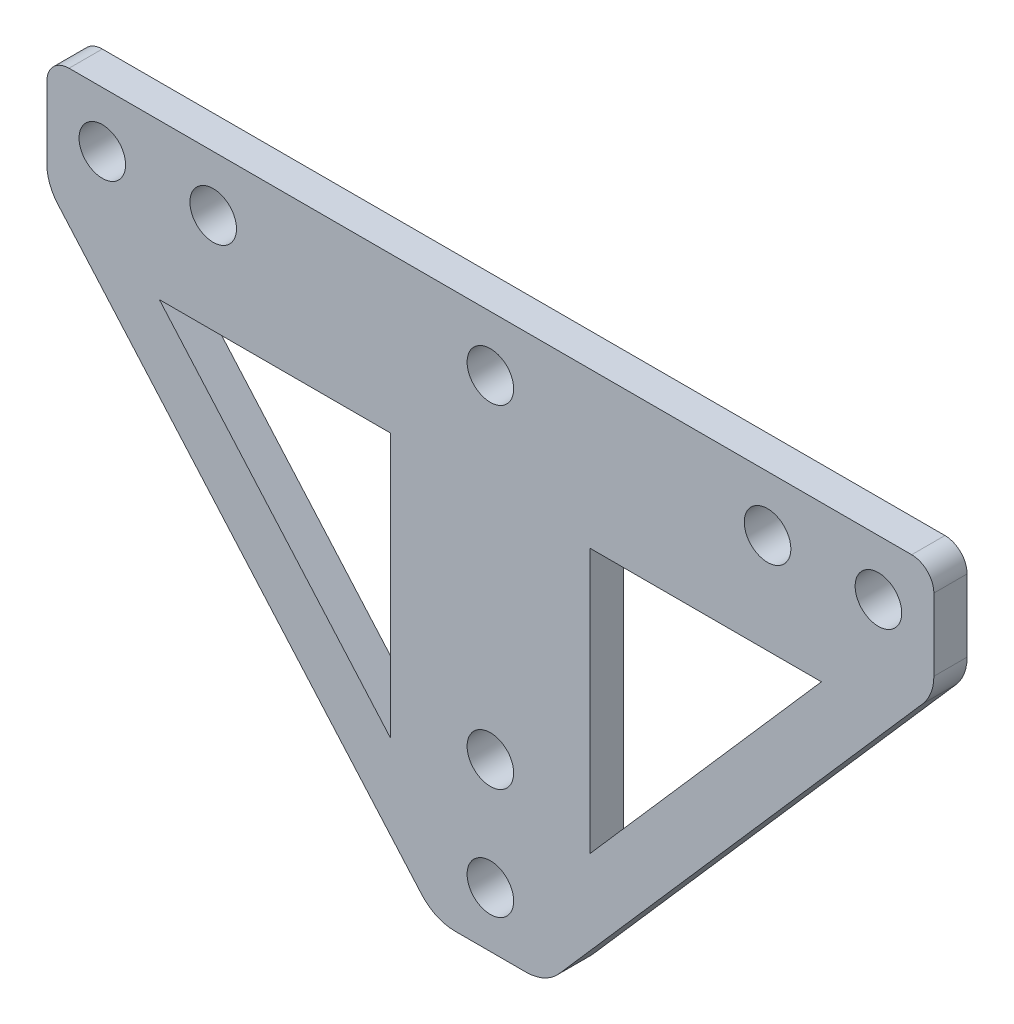
ISO-10303-21;
HEADER;
FILE_DESCRIPTION(('STEP AP214'),'2;1');
FILE_NAME('part.step','',(''),(''),'','','');
FILE_SCHEMA(('AUTOMOTIVE_DESIGN { 1 0 10303 214 1 1 1 1 }'));
ENDSEC;
DATA;
#1=APPLICATION_CONTEXT('core data for automotive mechanical design processes');
#2=APPLICATION_PROTOCOL_DEFINITION('international standard','automotive_design',2000,#1);
#3=PRODUCT_CONTEXT('',#1,'mechanical');
#4=PRODUCT('Part','Part','',(#3));
#5=PRODUCT_RELATED_PRODUCT_CATEGORY('part','',(#4));
#6=PRODUCT_DEFINITION_FORMATION('','',#4);
#7=PRODUCT_DEFINITION_CONTEXT('part definition',#1,'design');
#8=PRODUCT_DEFINITION('design','',#6,#7);
#9=PRODUCT_DEFINITION_SHAPE('','',#8);
#10=(LENGTH_UNIT() NAMED_UNIT(*) SI_UNIT(.MILLI.,.METRE.));
#11=(NAMED_UNIT(*) PLANE_ANGLE_UNIT() SI_UNIT($,.RADIAN.));
#12=(NAMED_UNIT(*) SI_UNIT($,.STERADIAN.) SOLID_ANGLE_UNIT());
#13=UNCERTAINTY_MEASURE_WITH_UNIT(LENGTH_MEASURE(1.E-05),#10,'distance_accuracy_value','');
#14=(GEOMETRIC_REPRESENTATION_CONTEXT(3) GLOBAL_UNCERTAINTY_ASSIGNED_CONTEXT((#13)) GLOBAL_UNIT_ASSIGNED_CONTEXT((#10,
#11,#12)) REPRESENTATION_CONTEXT('',''));
#15=CARTESIAN_POINT('',(0.,0.,0.));
#16=DIRECTION('',(0.,0.,1.));
#17=DIRECTION('',(1.,0.,0.));
#18=AXIS2_PLACEMENT_3D('',#15,#16,#17);
#19=CARTESIAN_POINT('',(0.,-10.,3.));
#20=DIRECTION('',(1.,0.,0.));
#21=DIRECTION('',(0.,0.,-1.));
#22=AXIS2_PLACEMENT_3D('',#19,#20,#21);
#23=PLANE('',#22);
#24=DIRECTION('',(0.,-1.,0.));
#25=VECTOR('',#24,1.);
#26=CARTESIAN_POINT('',(0.,-10.,0.));
#27=LINE('',#26,#25);
#28=CARTESIAN_POINT('',(0.,-2.,0.));
#29=VERTEX_POINT('',#28);
#30=CARTESIAN_POINT('',(0.,-8.49705953558021,0.));
#31=VERTEX_POINT('',#30);
#32=EDGE_CURVE('E250',#29,#31,#27,.T.);
#33=ORIENTED_EDGE('',*,*,#32,.T.);
#34=DIRECTION('',(0.,0.,-1.));
#35=VECTOR('',#34,1.);
#36=CARTESIAN_POINT('',(0.,-8.49705953558021,3.));
#37=LINE('',#36,#35);
#38=CARTESIAN_POINT('',(0.,-8.49705953558021,3.));
#39=VERTEX_POINT('',#38);
#40=EDGE_CURVE('E413',#31,#39,#37,.F.);
#41=ORIENTED_EDGE('',*,*,#40,.T.);
#42=DIRECTION('',(0.,-1.,0.));
#43=VECTOR('',#42,1.);
#44=CARTESIAN_POINT('',(0.,-10.,3.));
#45=LINE('',#44,#43);
#46=CARTESIAN_POINT('',(0.,-2.,3.));
#47=VERTEX_POINT('',#46);
#48=EDGE_CURVE('E302',#47,#39,#45,.T.);
#49=ORIENTED_EDGE('',*,*,#48,.F.);
#50=DIRECTION('',(0.,0.,-1.));
#51=VECTOR('',#50,1.);
#52=CARTESIAN_POINT('',(0.,-2.,3.));
#53=LINE('',#52,#51);
#54=EDGE_CURVE('E324',#47,#29,#53,.T.);
#55=ORIENTED_EDGE('',*,*,#54,.T.);
#56=EDGE_LOOP('',(#33,#41,#49,#55));
#57=FACE_BOUND('',#56,.T.);
#58=ADVANCED_FACE('F43',(#57),#23,.F.);
#59=CARTESIAN_POINT('',(35.,-50.,3.));
#60=DIRECTION('',(0.752576694706877,0.658504607868518,0.));
#61=DIRECTION('',(-0.658504607868518,0.752576694706878,0.));
#62=AXIS2_PLACEMENT_3D('',#59,#60,#61);
#63=PLANE('',#62);
#64=DIRECTION('',(0.658504607868518,-0.752576694706878,0.));
#65=VECTOR('',#64,1.);
#66=CARTESIAN_POINT('',(35.,-50.,3.));
#67=LINE('',#66,#65);
#68=CARTESIAN_POINT('',(0.98969322117249,-11.1310779670543,3.));
#69=VERTEX_POINT('',#68);
#70=CARTESIAN_POINT('',(33.8047661275398,-48.6340184314741,3.));
#71=VERTEX_POINT('',#70);
#72=EDGE_CURVE('E306',#69,#71,#67,.T.);
#73=ORIENTED_EDGE('',*,*,#72,.F.);
#74=DIRECTION('',(0.,0.,-1.));
#75=VECTOR('',#74,1.);
#76=CARTESIAN_POINT('',(0.98969322117249,-11.1310779670543,3.));
#77=LINE('',#76,#75);
#78=CARTESIAN_POINT('',(0.98969322117249,-11.1310779670543,0.));
#79=VERTEX_POINT('',#78);
#80=EDGE_CURVE('E409',#69,#79,#77,.T.);
#81=ORIENTED_EDGE('',*,*,#80,.T.);
#82=DIRECTION('',(0.658504607868518,-0.752576694706878,0.));
#83=VECTOR('',#82,1.);
#84=CARTESIAN_POINT('',(35.,-50.,0.));
#85=LINE('',#84,#83);
#86=CARTESIAN_POINT('',(33.8047661275398,-48.6340184314741,0.));
#87=VERTEX_POINT('',#86);
#88=EDGE_CURVE('E328',#79,#87,#85,.T.);
#89=ORIENTED_EDGE('',*,*,#88,.T.);
#90=DIRECTION('',(0.,0.,-1.));
#91=VECTOR('',#90,1.);
#92=CARTESIAN_POINT('',(33.8047661275398,-48.6340184314741,3.));
#93=LINE('',#92,#91);
#94=EDGE_CURVE('E406',#87,#71,#93,.F.);
#95=ORIENTED_EDGE('',*,*,#94,.T.);
#96=EDGE_LOOP('',(#73,#81,#89,#95));
#97=FACE_BOUND('',#96,.T.);
#98=ADVANCED_FACE('F465',(#97),#63,.F.);
#99=CARTESIAN_POINT('',(45.,-50.,3.));
#100=DIRECTION('',(0.,1.,0.));
#101=DIRECTION('',(0.,0.,1.));
#102=AXIS2_PLACEMENT_3D('',#99,#100,#101);
#103=PLANE('',#102);
#104=DIRECTION('',(1.,0.,0.));
#105=VECTOR('',#104,1.);
#106=CARTESIAN_POINT('',(45.,-50.,0.));
#107=LINE('',#106,#105);
#108=CARTESIAN_POINT('',(36.8150729063673,-50.,0.));
#109=VERTEX_POINT('',#108);
#110=CARTESIAN_POINT('',(43.1849270936327,-50.,0.));
#111=VERTEX_POINT('',#110);
#112=EDGE_CURVE('E332',#109,#111,#107,.T.);
#113=ORIENTED_EDGE('',*,*,#112,.T.);
#114=DIRECTION('',(0.,0.,-1.));
#115=VECTOR('',#114,1.);
#116=CARTESIAN_POINT('',(43.1849270936327,-50.,3.));
#117=LINE('',#116,#115);
#118=CARTESIAN_POINT('',(43.1849270936327,-50.,3.));
#119=VERTEX_POINT('',#118);
#120=EDGE_CURVE('E11',#111,#119,#117,.F.);
#121=ORIENTED_EDGE('',*,*,#120,.T.);
#122=DIRECTION('',(1.,0.,0.));
#123=VECTOR('',#122,1.);
#124=CARTESIAN_POINT('',(45.,-50.,3.));
#125=LINE('',#124,#123);
#126=CARTESIAN_POINT('',(36.8150729063673,-50.,3.));
#127=VERTEX_POINT('',#126);
#128=EDGE_CURVE('E310',#127,#119,#125,.T.);
#129=ORIENTED_EDGE('',*,*,#128,.F.);
#130=DIRECTION('',(0.,0.,-1.));
#131=VECTOR('',#130,1.);
#132=CARTESIAN_POINT('',(36.8150729063673,-50.,3.));
#133=LINE('',#132,#131);
#134=EDGE_CURVE('E52',#127,#109,#133,.T.);
#135=ORIENTED_EDGE('',*,*,#134,.T.);
#136=EDGE_LOOP('',(#113,#121,#129,#135));
#137=FACE_BOUND('',#136,.T.);
#138=ADVANCED_FACE('F419',(#137),#103,.F.);
#139=CARTESIAN_POINT('',(80.,-9.99999999999999,3.));
#140=DIRECTION('',(-0.752576694706878,0.658504607868518,0.));
#141=DIRECTION('',(-0.658504607868518,-0.752576694706878,0.));
#142=AXIS2_PLACEMENT_3D('',#139,#140,#141);
#143=PLANE('',#142);
#144=DIRECTION('',(0.658504607868518,0.752576694706878,0.));
#145=VECTOR('',#144,1.);
#146=CARTESIAN_POINT('',(80.,-9.99999999999999,0.));
#147=LINE('',#146,#145);
#148=CARTESIAN_POINT('',(46.1952338724602,-48.6340184314741,0.));
#149=VERTEX_POINT('',#148);
#150=CARTESIAN_POINT('',(79.0103067788275,-11.1310779670543,0.));
#151=VERTEX_POINT('',#150);
#152=EDGE_CURVE('E335',#149,#151,#147,.T.);
#153=ORIENTED_EDGE('',*,*,#152,.T.);
#154=DIRECTION('',(0.,0.,-1.));
#155=VECTOR('',#154,1.);
#156=CARTESIAN_POINT('',(79.0103067788275,-11.1310779670543,3.));
#157=LINE('',#156,#155);
#158=CARTESIAN_POINT('',(79.0103067788275,-11.1310779670543,3.));
#159=VERTEX_POINT('',#158);
#160=EDGE_CURVE('E392',#151,#159,#157,.F.);
#161=ORIENTED_EDGE('',*,*,#160,.T.);
#162=DIRECTION('',(0.658504607868518,0.752576694706878,0.));
#163=VECTOR('',#162,1.);
#164=CARTESIAN_POINT('',(80.,-9.99999999999999,3.));
#165=LINE('',#164,#163);
#166=CARTESIAN_POINT('',(46.1952338724602,-48.6340184314741,3.));
#167=VERTEX_POINT('',#166);
#168=EDGE_CURVE('E313',#167,#159,#165,.T.);
#169=ORIENTED_EDGE('',*,*,#168,.F.);
#170=DIRECTION('',(0.,0.,-1.));
#171=VECTOR('',#170,1.);
#172=CARTESIAN_POINT('',(46.1952338724602,-48.6340184314741,3.));
#173=LINE('',#172,#171);
#174=EDGE_CURVE('E388',#167,#149,#173,.T.);
#175=ORIENTED_EDGE('',*,*,#174,.T.);
#176=EDGE_LOOP('',(#153,#161,#169,#175));
#177=FACE_BOUND('',#176,.T.);
#178=ADVANCED_FACE('F431',(#177),#143,.F.);
#179=CARTESIAN_POINT('',(80.,0.,3.));
#180=DIRECTION('',(-1.,0.,0.));
#181=DIRECTION('',(0.,0.,1.));
#182=AXIS2_PLACEMENT_3D('',#179,#180,#181);
#183=PLANE('',#182);
#184=DIRECTION('',(0.,1.,0.));
#185=VECTOR('',#184,1.);
#186=CARTESIAN_POINT('',(80.,0.,3.));
#187=LINE('',#186,#185);
#188=CARTESIAN_POINT('',(80.,-8.4970595355802,3.));
#189=VERTEX_POINT('',#188);
#190=CARTESIAN_POINT('',(80.,-1.99999999999999,3.));
#191=VERTEX_POINT('',#190);
#192=EDGE_CURVE('E317',#189,#191,#187,.T.);
#193=ORIENTED_EDGE('',*,*,#192,.F.);
#194=DIRECTION('',(0.,0.,-1.));
#195=VECTOR('',#194,1.);
#196=CARTESIAN_POINT('',(80.,-8.4970595355802,3.));
#197=LINE('',#196,#195);
#198=CARTESIAN_POINT('',(80.,-8.4970595355802,0.));
#199=VERTEX_POINT('',#198);
#200=EDGE_CURVE('E372',#189,#199,#197,.T.);
#201=ORIENTED_EDGE('',*,*,#200,.T.);
#202=DIRECTION('',(0.,1.,0.));
#203=VECTOR('',#202,1.);
#204=CARTESIAN_POINT('',(80.,0.,0.));
#205=LINE('',#204,#203);
#206=CARTESIAN_POINT('',(80.,-1.99999999999999,0.));
#207=VERTEX_POINT('',#206);
#208=EDGE_CURVE('E339',#199,#207,#205,.T.);
#209=ORIENTED_EDGE('',*,*,#208,.T.);
#210=DIRECTION('',(0.,0.,-1.));
#211=VECTOR('',#210,1.);
#212=CARTESIAN_POINT('',(80.,-1.99999999999999,3.));
#213=LINE('',#212,#211);
#214=EDGE_CURVE('E368',#207,#191,#213,.F.);
#215=ORIENTED_EDGE('',*,*,#214,.T.);
#216=EDGE_LOOP('',(#193,#201,#209,#215));
#217=FACE_BOUND('',#216,.T.);
#218=ADVANCED_FACE('F440',(#217),#183,.F.);
#219=CARTESIAN_POINT('',(0.,0.,3.));
#220=DIRECTION('',(0.,-1.,0.));
#221=DIRECTION('',(1.,0.,0.));
#222=AXIS2_PLACEMENT_3D('',#219,#220,#221);
#223=PLANE('',#222);
#224=DIRECTION('',(-1.,0.,0.));
#225=VECTOR('',#224,1.);
#226=CARTESIAN_POINT('',(0.,0.,0.));
#227=LINE('',#226,#225);
#228=CARTESIAN_POINT('',(78.,0.,0.));
#229=VERTEX_POINT('',#228);
#230=CARTESIAN_POINT('',(2.,0.,0.));
#231=VERTEX_POINT('',#230);
#232=EDGE_CURVE('E307',#229,#231,#227,.T.);
#233=ORIENTED_EDGE('',*,*,#232,.T.);
#234=DIRECTION('',(0.,0.,-1.));
#235=VECTOR('',#234,1.);
#236=CARTESIAN_POINT('',(2.,0.,3.));
#237=LINE('',#236,#235);
#238=CARTESIAN_POINT('',(2.,0.,3.));
#239=VERTEX_POINT('',#238);
#240=EDGE_CURVE('E359',#231,#239,#237,.F.);
#241=ORIENTED_EDGE('',*,*,#240,.T.);
#242=DIRECTION('',(-1.,0.,0.));
#243=VECTOR('',#242,1.);
#244=CARTESIAN_POINT('',(0.,0.,3.));
#245=LINE('',#244,#243);
#246=CARTESIAN_POINT('',(78.,0.,3.));
#247=VERTEX_POINT('',#246);
#248=EDGE_CURVE('E320',#247,#239,#245,.T.);
#249=ORIENTED_EDGE('',*,*,#248,.F.);
#250=DIRECTION('',(0.,0.,-1.));
#251=VECTOR('',#250,1.);
#252=CARTESIAN_POINT('',(78.,0.,3.));
#253=LINE('',#252,#251);
#254=EDGE_CURVE('E355',#247,#229,#253,.T.);
#255=ORIENTED_EDGE('',*,*,#254,.T.);
#256=EDGE_LOOP('',(#233,#241,#249,#255));
#257=FACE_BOUND('',#256,.T.);
#258=ADVANCED_FACE('F450',(#257),#223,.F.);
#259=CARTESIAN_POINT('',(0.,0.,3.));
#260=DIRECTION('',(0.,0.,-1.));
#261=DIRECTION('',(-1.,0.,0.));
#262=AXIS2_PLACEMENT_3D('',#259,#260,#261);
#263=PLANE('',#262);
#264=DIRECTION('',(0.,1.,0.));
#265=VECTOR('',#264,1.);
#266=CARTESIAN_POINT('',(31.,-14.,3.));
#267=LINE('',#266,#265);
#268=CARTESIAN_POINT('',(31.,-37.835610133761,3.));
#269=VERTEX_POINT('',#268);
#270=CARTESIAN_POINT('',(31.,-14.,3.));
#271=VERTEX_POINT('',#270);
#272=EDGE_CURVE('E198',#269,#271,#267,.T.);
#273=ORIENTED_EDGE('',*,*,#272,.F.);
#274=DIRECTION('',(0.658504607868518,-0.752576694706878,0.));
#275=VECTOR('',#274,1.);
#276=CARTESIAN_POINT('',(31.,-37.835610133761,3.));
#277=LINE('',#276,#275);
#278=CARTESIAN_POINT('',(10.1438411329592,-14.,3.));
#279=VERTEX_POINT('',#278);
#280=EDGE_CURVE('E176',#279,#269,#277,.T.);
#281=ORIENTED_EDGE('',*,*,#280,.F.);
#282=DIRECTION('',(-1.,0.,0.));
#283=VECTOR('',#282,1.);
#284=CARTESIAN_POINT('',(10.1438411329592,-14.,3.));
#285=LINE('',#284,#283);
#286=EDGE_CURVE('E194',#271,#279,#285,.T.);
#287=ORIENTED_EDGE('',*,*,#286,.F.);
#288=EDGE_LOOP('',(#273,#281,#287));
#289=FACE_BOUND('',#288,.T.);
#290=DIRECTION('',(0.658504607868518,0.752576694706878,0.));
#291=VECTOR('',#290,1.);
#292=CARTESIAN_POINT('',(49.,-37.835610133761,3.));
#293=LINE('',#292,#291);
#294=CARTESIAN_POINT('',(49.,-37.835610133761,3.));
#295=VERTEX_POINT('',#294);
#296=CARTESIAN_POINT('',(69.8561588670408,-14.,3.));
#297=VERTEX_POINT('',#296);
#298=EDGE_CURVE('E229',#295,#297,#293,.T.);
#299=ORIENTED_EDGE('',*,*,#298,.F.);
#300=DIRECTION('',(0.,-1.,0.));
#301=VECTOR('',#300,1.);
#302=CARTESIAN_POINT('',(49.,-14.,3.));
#303=LINE('',#302,#301);
#304=CARTESIAN_POINT('',(49.,-14.,3.));
#305=VERTEX_POINT('',#304);
#306=EDGE_CURVE('E205',#305,#295,#303,.T.);
#307=ORIENTED_EDGE('',*,*,#306,.F.);
#308=DIRECTION('',(-1.,0.,0.));
#309=VECTOR('',#308,1.);
#310=CARTESIAN_POINT('',(69.8561588670408,-14.,3.));
#311=LINE('',#310,#309);
#312=EDGE_CURVE('E225',#297,#305,#311,.T.);
#313=ORIENTED_EDGE('',*,*,#312,.F.);
#314=EDGE_LOOP('',(#299,#307,#313));
#315=FACE_BOUND('',#314,.T.);
#316=CARTESIAN_POINT('',(5.,-4.99999999999999,3.));
#317=DIRECTION('',(0.,0.,1.));
#318=DIRECTION('',(1.,0.,0.));
#319=AXIS2_PLACEMENT_3D('',#316,#317,#318);
#320=CIRCLE('',#319,2.1);
#321=CARTESIAN_POINT('',(7.1,-4.99999999999999,3.));
#322=VERTEX_POINT('',#321);
#323=EDGE_CURVE('E251',#322,#322,#320,.T.);
#324=ORIENTED_EDGE('',*,*,#323,.F.);
#325=EDGE_LOOP('',(#324));
#326=FACE_BOUND('',#325,.T.);
#327=CARTESIAN_POINT('',(40.,-4.99999999999999,3.));
#328=DIRECTION('',(0.,0.,1.));
#329=DIRECTION('',(1.,0.,0.));
#330=AXIS2_PLACEMENT_3D('',#327,#328,#329);
#331=CIRCLE('',#330,2.1);
#332=CARTESIAN_POINT('',(42.1,-4.99999999999999,3.));
#333=VERTEX_POINT('',#332);
#334=EDGE_CURVE('E265',#333,#333,#331,.T.);
#335=ORIENTED_EDGE('',*,*,#334,.F.);
#336=EDGE_LOOP('',(#335));
#337=FACE_BOUND('',#336,.T.);
#338=CARTESIAN_POINT('',(40.,-35.,3.));
#339=DIRECTION('',(0.,0.,1.));
#340=DIRECTION('',(1.,0.,0.));
#341=AXIS2_PLACEMENT_3D('',#338,#339,#340);
#342=CIRCLE('',#341,2.1);
#343=CARTESIAN_POINT('',(42.1,-35.,3.));
#344=VERTEX_POINT('',#343);
#345=EDGE_CURVE('E256',#344,#344,#342,.T.);
#346=ORIENTED_EDGE('',*,*,#345,.F.);
#347=EDGE_LOOP('',(#346));
#348=FACE_BOUND('',#347,.T.);
#349=CARTESIAN_POINT('',(15.,-4.99999999999999,3.));
#350=DIRECTION('',(0.,0.,1.));
#351=DIRECTION('',(1.,0.,0.));
#352=AXIS2_PLACEMENT_3D('',#349,#350,#351);
#353=CIRCLE('',#352,2.1);
#354=CARTESIAN_POINT('',(17.1,-4.99999999999999,3.));
#355=VERTEX_POINT('',#354);
#356=EDGE_CURVE('E255',#355,#355,#353,.T.);
#357=ORIENTED_EDGE('',*,*,#356,.F.);
#358=EDGE_LOOP('',(#357));
#359=FACE_BOUND('',#358,.T.);
#360=CARTESIAN_POINT('',(65.,-4.99999999999999,3.));
#361=DIRECTION('',(0.,0.,1.));
#362=DIRECTION('',(-1.,0.,0.));
#363=AXIS2_PLACEMENT_3D('',#360,#361,#362);
#364=CIRCLE('',#363,2.1);
#365=CARTESIAN_POINT('',(62.9,-4.99999999999999,3.));
#366=VERTEX_POINT('',#365);
#367=EDGE_CURVE('E295',#366,#366,#364,.T.);
#368=ORIENTED_EDGE('',*,*,#367,.F.);
#369=EDGE_LOOP('',(#368));
#370=FACE_BOUND('',#369,.T.);
#371=CARTESIAN_POINT('',(75.,-4.99999999999999,3.));
#372=DIRECTION('',(0.,0.,1.));
#373=DIRECTION('',(-1.,0.,0.));
#374=AXIS2_PLACEMENT_3D('',#371,#372,#373);
#375=CIRCLE('',#374,2.09999999999999);
#376=CARTESIAN_POINT('',(72.9,-4.99999999999999,3.));
#377=VERTEX_POINT('',#376);
#378=EDGE_CURVE('E272',#377,#377,#375,.T.);
#379=ORIENTED_EDGE('',*,*,#378,.F.);
#380=EDGE_LOOP('',(#379));
#381=FACE_BOUND('',#380,.T.);
#382=CARTESIAN_POINT('',(40.,-45.,3.));
#383=DIRECTION('',(0.,0.,1.));
#384=DIRECTION('',(1.,0.,0.));
#385=AXIS2_PLACEMENT_3D('',#382,#383,#384);
#386=CIRCLE('',#385,2.1);
#387=CARTESIAN_POINT('',(42.1,-45.,3.));
#388=VERTEX_POINT('',#387);
#389=EDGE_CURVE('E281',#388,#388,#386,.T.);
#390=ORIENTED_EDGE('',*,*,#389,.F.);
#391=EDGE_LOOP('',(#390));
#392=FACE_BOUND('',#391,.T.);
#393=ORIENTED_EDGE('',*,*,#168,.T.);
#394=CARTESIAN_POINT('',(76.,-8.4970595355802,3.));
#395=DIRECTION('',(0.,0.,-1.));
#396=DIRECTION('',(-1.,0.,0.));
#397=AXIS2_PLACEMENT_3D('',#394,#395,#396);
#398=CIRCLE('',#397,4.);
#399=EDGE_CURVE('E403',#159,#189,#398,.F.);
#400=ORIENTED_EDGE('',*,*,#399,.T.);
#401=ORIENTED_EDGE('',*,*,#192,.T.);
#402=CARTESIAN_POINT('',(78.,-1.99999999999999,3.));
#403=DIRECTION('',(0.,0.,-1.));
#404=DIRECTION('',(-1.,0.,0.));
#405=AXIS2_PLACEMENT_3D('',#402,#403,#404);
#406=CIRCLE('',#405,2.);
#407=EDGE_CURVE('E362',#191,#247,#406,.F.);
#408=ORIENTED_EDGE('',*,*,#407,.T.);
#409=ORIENTED_EDGE('',*,*,#248,.T.);
#410=CARTESIAN_POINT('',(2.,-2.,3.));
#411=DIRECTION('',(0.,0.,-1.));
#412=DIRECTION('',(-1.,0.,0.));
#413=AXIS2_PLACEMENT_3D('',#410,#411,#412);
#414=CIRCLE('',#413,2.);
#415=EDGE_CURVE('E365',#239,#47,#414,.F.);
#416=ORIENTED_EDGE('',*,*,#415,.T.);
#417=ORIENTED_EDGE('',*,*,#48,.T.);
#418=CARTESIAN_POINT('',(4.,-8.49705953558021,3.));
#419=DIRECTION('',(0.,0.,-1.));
#420=DIRECTION('',(-1.,0.,0.));
#421=AXIS2_PLACEMENT_3D('',#418,#419,#420);
#422=CIRCLE('',#421,4.);
#423=EDGE_CURVE('E400',#39,#69,#422,.F.);
#424=ORIENTED_EDGE('',*,*,#423,.T.);
#425=ORIENTED_EDGE('',*,*,#72,.T.);
#426=CARTESIAN_POINT('',(36.8150729063673,-46.,3.));
#427=DIRECTION('',(0.,0.,-1.));
#428=DIRECTION('',(-1.,0.,0.));
#429=AXIS2_PLACEMENT_3D('',#426,#427,#428);
#430=CIRCLE('',#429,4.);
#431=EDGE_CURVE('E64',#71,#127,#430,.F.);
#432=ORIENTED_EDGE('',*,*,#431,.T.);
#433=ORIENTED_EDGE('',*,*,#128,.T.);
#434=CARTESIAN_POINT('',(43.1849270936327,-46.,3.));
#435=DIRECTION('',(0.,0.,-1.));
#436=DIRECTION('',(-1.,0.,0.));
#437=AXIS2_PLACEMENT_3D('',#434,#435,#436);
#438=CIRCLE('',#437,4.);
#439=EDGE_CURVE('E397',#119,#167,#438,.F.);
#440=ORIENTED_EDGE('',*,*,#439,.T.);
#441=EDGE_LOOP('',(#393,#400,#401,#408,#409,#416,#417,#424,#425,#432,#433,#440));
#442=FACE_BOUND('',#441,.T.);
#443=ADVANCED_FACE('F434',(#289,#315,#326,#337,#348,#359,#370,#381,#392,#442),#263,.F.);
#444=CARTESIAN_POINT('',(0.,0.,0.));
#445=DIRECTION('',(0.,0.,-1.));
#446=DIRECTION('',(-1.,0.,0.));
#447=AXIS2_PLACEMENT_3D('',#444,#445,#446);
#448=PLANE('',#447);
#449=DIRECTION('',(0.658504607868518,-0.752576694706878,0.));
#450=VECTOR('',#449,1.);
#451=CARTESIAN_POINT('',(31.,-37.835610133761,0.));
#452=LINE('',#451,#450);
#453=CARTESIAN_POINT('',(10.1438411329592,-14.,0.));
#454=VERTEX_POINT('',#453);
#455=CARTESIAN_POINT('',(31.,-37.835610133761,0.));
#456=VERTEX_POINT('',#455);
#457=EDGE_CURVE('E173',#454,#456,#452,.T.);
#458=ORIENTED_EDGE('',*,*,#457,.T.);
#459=DIRECTION('',(0.,1.,0.));
#460=VECTOR('',#459,1.);
#461=CARTESIAN_POINT('',(31.,-14.,0.));
#462=LINE('',#461,#460);
#463=CARTESIAN_POINT('',(31.,-14.,0.));
#464=VERTEX_POINT('',#463);
#465=EDGE_CURVE('E186',#456,#464,#462,.T.);
#466=ORIENTED_EDGE('',*,*,#465,.T.);
#467=DIRECTION('',(-1.,0.,0.));
#468=VECTOR('',#467,1.);
#469=CARTESIAN_POINT('',(10.1438411329592,-14.,0.));
#470=LINE('',#469,#468);
#471=EDGE_CURVE('E182',#464,#454,#470,.T.);
#472=ORIENTED_EDGE('',*,*,#471,.T.);
#473=EDGE_LOOP('',(#458,#466,#472));
#474=FACE_BOUND('',#473,.T.);
#475=DIRECTION('',(0.,-1.,0.));
#476=VECTOR('',#475,1.);
#477=CARTESIAN_POINT('',(49.,-14.,0.));
#478=LINE('',#477,#476);
#479=CARTESIAN_POINT('',(49.,-14.,0.));
#480=VERTEX_POINT('',#479);
#481=CARTESIAN_POINT('',(49.,-37.835610133761,0.));
#482=VERTEX_POINT('',#481);
#483=EDGE_CURVE('E230',#480,#482,#478,.T.);
#484=ORIENTED_EDGE('',*,*,#483,.T.);
#485=DIRECTION('',(0.658504607868518,0.752576694706878,0.));
#486=VECTOR('',#485,1.);
#487=CARTESIAN_POINT('',(49.,-37.835610133761,0.));
#488=LINE('',#487,#486);
#489=CARTESIAN_POINT('',(69.8561588670408,-14.,0.));
#490=VERTEX_POINT('',#489);
#491=EDGE_CURVE('E239',#482,#490,#488,.T.);
#492=ORIENTED_EDGE('',*,*,#491,.T.);
#493=DIRECTION('',(-1.,0.,0.));
#494=VECTOR('',#493,1.);
#495=CARTESIAN_POINT('',(69.8561588670408,-14.,0.));
#496=LINE('',#495,#494);
#497=EDGE_CURVE('E218',#490,#480,#496,.T.);
#498=ORIENTED_EDGE('',*,*,#497,.T.);
#499=EDGE_LOOP('',(#484,#492,#498));
#500=FACE_BOUND('',#499,.T.);
#501=CARTESIAN_POINT('',(5.,-4.99999999999999,0.));
#502=DIRECTION('',(0.,0.,1.));
#503=DIRECTION('',(1.,0.,0.));
#504=AXIS2_PLACEMENT_3D('',#501,#502,#503);
#505=CIRCLE('',#504,2.1);
#506=CARTESIAN_POINT('',(7.1,-4.99999999999999,0.));
#507=VERTEX_POINT('',#506);
#508=EDGE_CURVE('E246',#507,#507,#505,.T.);
#509=ORIENTED_EDGE('',*,*,#508,.T.);
#510=EDGE_LOOP('',(#509));
#511=FACE_BOUND('',#510,.T.);
#512=CARTESIAN_POINT('',(40.,-4.99999999999999,0.));
#513=DIRECTION('',(0.,0.,1.));
#514=DIRECTION('',(1.,0.,0.));
#515=AXIS2_PLACEMENT_3D('',#512,#513,#514);
#516=CIRCLE('',#515,2.1);
#517=CARTESIAN_POINT('',(42.1,-4.99999999999999,0.));
#518=VERTEX_POINT('',#517);
#519=EDGE_CURVE('E211',#518,#518,#516,.T.);
#520=ORIENTED_EDGE('',*,*,#519,.T.);
#521=EDGE_LOOP('',(#520));
#522=FACE_BOUND('',#521,.T.);
#523=CARTESIAN_POINT('',(40.,-35.,0.));
#524=DIRECTION('',(0.,0.,1.));
#525=DIRECTION('',(1.,0.,0.));
#526=AXIS2_PLACEMENT_3D('',#523,#524,#525);
#527=CIRCLE('',#526,2.1);
#528=CARTESIAN_POINT('',(42.1,-35.,0.));
#529=VERTEX_POINT('',#528);
#530=EDGE_CURVE('E261',#529,#529,#527,.T.);
#531=ORIENTED_EDGE('',*,*,#530,.T.);
#532=EDGE_LOOP('',(#531));
#533=FACE_BOUND('',#532,.T.);
#534=CARTESIAN_POINT('',(15.,-4.99999999999999,0.));
#535=DIRECTION('',(0.,0.,1.));
#536=DIRECTION('',(1.,0.,0.));
#537=AXIS2_PLACEMENT_3D('',#534,#535,#536);
#538=CIRCLE('',#537,2.1);
#539=CARTESIAN_POINT('',(17.1,-4.99999999999999,0.));
#540=VERTEX_POINT('',#539);
#541=EDGE_CURVE('E291',#540,#540,#538,.T.);
#542=ORIENTED_EDGE('',*,*,#541,.T.);
#543=EDGE_LOOP('',(#542));
#544=FACE_BOUND('',#543,.T.);
#545=CARTESIAN_POINT('',(65.,-4.99999999999999,0.));
#546=DIRECTION('',(0.,0.,1.));
#547=DIRECTION('',(-1.,0.,0.));
#548=AXIS2_PLACEMENT_3D('',#545,#546,#547);
#549=CIRCLE('',#548,2.1);
#550=CARTESIAN_POINT('',(62.9,-4.99999999999999,0.));
#551=VERTEX_POINT('',#550);
#552=EDGE_CURVE('E276',#551,#551,#549,.T.);
#553=ORIENTED_EDGE('',*,*,#552,.T.);
#554=EDGE_LOOP('',(#553));
#555=FACE_BOUND('',#554,.T.);
#556=CARTESIAN_POINT('',(75.,-4.99999999999999,0.));
#557=DIRECTION('',(0.,0.,1.));
#558=DIRECTION('',(-1.,0.,0.));
#559=AXIS2_PLACEMENT_3D('',#556,#557,#558);
#560=CIRCLE('',#559,2.09999999999999);
#561=CARTESIAN_POINT('',(72.9,-4.99999999999999,0.));
#562=VERTEX_POINT('',#561);
#563=EDGE_CURVE('E277',#562,#562,#560,.T.);
#564=ORIENTED_EDGE('',*,*,#563,.T.);
#565=EDGE_LOOP('',(#564));
#566=FACE_BOUND('',#565,.T.);
#567=CARTESIAN_POINT('',(40.,-45.,0.));
#568=DIRECTION('',(0.,0.,1.));
#569=DIRECTION('',(1.,0.,0.));
#570=AXIS2_PLACEMENT_3D('',#567,#568,#569);
#571=CIRCLE('',#570,2.1);
#572=CARTESIAN_POINT('',(42.1,-45.,0.));
#573=VERTEX_POINT('',#572);
#574=EDGE_CURVE('E260',#573,#573,#571,.T.);
#575=ORIENTED_EDGE('',*,*,#574,.T.);
#576=EDGE_LOOP('',(#575));
#577=FACE_BOUND('',#576,.T.);
#578=ORIENTED_EDGE('',*,*,#208,.F.);
#579=CARTESIAN_POINT('',(76.,-8.4970595355802,0.));
#580=DIRECTION('',(0.,0.,-1.));
#581=DIRECTION('',(-1.,0.,0.));
#582=AXIS2_PLACEMENT_3D('',#579,#580,#581);
#583=CIRCLE('',#582,4.);
#584=EDGE_CURVE('E385',#199,#151,#583,.T.);
#585=ORIENTED_EDGE('',*,*,#584,.T.);
#586=ORIENTED_EDGE('',*,*,#152,.F.);
#587=CARTESIAN_POINT('',(43.1849270936327,-46.,0.));
#588=DIRECTION('',(0.,0.,-1.));
#589=DIRECTION('',(-1.,0.,0.));
#590=AXIS2_PLACEMENT_3D('',#587,#588,#589);
#591=CIRCLE('',#590,4.);
#592=EDGE_CURVE('E379',#149,#111,#591,.T.);
#593=ORIENTED_EDGE('',*,*,#592,.T.);
#594=ORIENTED_EDGE('',*,*,#112,.F.);
#595=CARTESIAN_POINT('',(36.8150729063673,-46.,0.));
#596=DIRECTION('',(0.,0.,-1.));
#597=DIRECTION('',(-1.,0.,0.));
#598=AXIS2_PLACEMENT_3D('',#595,#596,#597);
#599=CIRCLE('',#598,4.);
#600=EDGE_CURVE('E376',#109,#87,#599,.T.);
#601=ORIENTED_EDGE('',*,*,#600,.T.);
#602=ORIENTED_EDGE('',*,*,#88,.F.);
#603=CARTESIAN_POINT('',(4.,-8.49705953558021,0.));
#604=DIRECTION('',(0.,0.,-1.));
#605=DIRECTION('',(-1.,0.,0.));
#606=AXIS2_PLACEMENT_3D('',#603,#604,#605);
#607=CIRCLE('',#606,4.);
#608=EDGE_CURVE('E382',#79,#31,#607,.T.);
#609=ORIENTED_EDGE('',*,*,#608,.T.);
#610=ORIENTED_EDGE('',*,*,#32,.F.);
#611=CARTESIAN_POINT('',(2.,-2.,0.));
#612=DIRECTION('',(0.,0.,-1.));
#613=DIRECTION('',(-1.,0.,0.));
#614=AXIS2_PLACEMENT_3D('',#611,#612,#613);
#615=CIRCLE('',#614,2.);
#616=EDGE_CURVE('E352',#29,#231,#615,.T.);
#617=ORIENTED_EDGE('',*,*,#616,.T.);
#618=ORIENTED_EDGE('',*,*,#232,.F.);
#619=CARTESIAN_POINT('',(78.,-1.99999999999999,0.));
#620=DIRECTION('',(0.,0.,-1.));
#621=DIRECTION('',(-1.,0.,0.));
#622=AXIS2_PLACEMENT_3D('',#619,#620,#621);
#623=CIRCLE('',#622,2.);
#624=EDGE_CURVE('E348',#229,#207,#623,.T.);
#625=ORIENTED_EDGE('',*,*,#624,.T.);
#626=EDGE_LOOP('',(#578,#585,#586,#593,#594,#601,#602,#609,#610,#617,#618,#625));
#627=FACE_BOUND('',#626,.T.);
#628=ADVANCED_FACE('F191',(#474,#500,#511,#522,#533,#544,#555,#566,#577,#627),#448,.T.);
#629=CARTESIAN_POINT('',(40.,-45.,0.));
#630=DIRECTION('',(0.,0.,1.));
#631=DIRECTION('',(1.,0.,0.));
#632=AXIS2_PLACEMENT_3D('',#629,#630,#631);
#633=CYLINDRICAL_SURFACE('',#632,2.1);
#634=ORIENTED_EDGE('',*,*,#574,.F.);
#635=EDGE_LOOP('',(#634));
#636=FACE_BOUND('',#635,.T.);
#637=ORIENTED_EDGE('',*,*,#389,.T.);
#638=EDGE_LOOP('',(#637));
#639=FACE_BOUND('',#638,.T.);
#640=ADVANCED_FACE('F639',(#636,#639),#633,.F.);
#641=CARTESIAN_POINT('',(75.,-4.99999999999999,0.));
#642=DIRECTION('',(0.,0.,1.));
#643=DIRECTION('',(1.,0.,0.));
#644=AXIS2_PLACEMENT_3D('',#641,#642,#643);
#645=CYLINDRICAL_SURFACE('',#644,2.09999999999999);
#646=ORIENTED_EDGE('',*,*,#563,.F.);
#647=EDGE_LOOP('',(#646));
#648=FACE_BOUND('',#647,.T.);
#649=ORIENTED_EDGE('',*,*,#378,.T.);
#650=EDGE_LOOP('',(#649));
#651=FACE_BOUND('',#650,.T.);
#652=ADVANCED_FACE('F629',(#648,#651),#645,.F.);
#653=CARTESIAN_POINT('',(65.,-4.99999999999999,0.));
#654=DIRECTION('',(0.,0.,1.));
#655=DIRECTION('',(1.,0.,0.));
#656=AXIS2_PLACEMENT_3D('',#653,#654,#655);
#657=CYLINDRICAL_SURFACE('',#656,2.1);
#658=ORIENTED_EDGE('',*,*,#552,.F.);
#659=EDGE_LOOP('',(#658));
#660=FACE_BOUND('',#659,.T.);
#661=ORIENTED_EDGE('',*,*,#367,.T.);
#662=EDGE_LOOP('',(#661));
#663=FACE_BOUND('',#662,.T.);
#664=ADVANCED_FACE('F619',(#660,#663),#657,.F.);
#665=CARTESIAN_POINT('',(15.,-4.99999999999999,0.));
#666=DIRECTION('',(0.,0.,1.));
#667=DIRECTION('',(1.,0.,0.));
#668=AXIS2_PLACEMENT_3D('',#665,#666,#667);
#669=CYLINDRICAL_SURFACE('',#668,2.1);
#670=ORIENTED_EDGE('',*,*,#541,.F.);
#671=EDGE_LOOP('',(#670));
#672=FACE_BOUND('',#671,.T.);
#673=ORIENTED_EDGE('',*,*,#356,.T.);
#674=EDGE_LOOP('',(#673));
#675=FACE_BOUND('',#674,.T.);
#676=ADVANCED_FACE('F609',(#672,#675),#669,.F.);
#677=CARTESIAN_POINT('',(40.,-35.,0.));
#678=DIRECTION('',(0.,0.,1.));
#679=DIRECTION('',(1.,0.,0.));
#680=AXIS2_PLACEMENT_3D('',#677,#678,#679);
#681=CYLINDRICAL_SURFACE('',#680,2.1);
#682=ORIENTED_EDGE('',*,*,#530,.F.);
#683=EDGE_LOOP('',(#682));
#684=FACE_BOUND('',#683,.T.);
#685=ORIENTED_EDGE('',*,*,#345,.T.);
#686=EDGE_LOOP('',(#685));
#687=FACE_BOUND('',#686,.T.);
#688=ADVANCED_FACE('F599',(#684,#687),#681,.F.);
#689=CARTESIAN_POINT('',(40.,-4.99999999999999,0.));
#690=DIRECTION('',(0.,0.,1.));
#691=DIRECTION('',(1.,0.,0.));
#692=AXIS2_PLACEMENT_3D('',#689,#690,#691);
#693=CYLINDRICAL_SURFACE('',#692,2.1);
#694=ORIENTED_EDGE('',*,*,#519,.F.);
#695=EDGE_LOOP('',(#694));
#696=FACE_BOUND('',#695,.T.);
#697=ORIENTED_EDGE('',*,*,#334,.T.);
#698=EDGE_LOOP('',(#697));
#699=FACE_BOUND('',#698,.T.);
#700=ADVANCED_FACE('F589',(#696,#699),#693,.F.);
#701=CARTESIAN_POINT('',(5.,-4.99999999999999,0.));
#702=DIRECTION('',(0.,0.,1.));
#703=DIRECTION('',(1.,0.,0.));
#704=AXIS2_PLACEMENT_3D('',#701,#702,#703);
#705=CYLINDRICAL_SURFACE('',#704,2.1);
#706=ORIENTED_EDGE('',*,*,#508,.F.);
#707=EDGE_LOOP('',(#706));
#708=FACE_BOUND('',#707,.T.);
#709=ORIENTED_EDGE('',*,*,#323,.T.);
#710=EDGE_LOOP('',(#709));
#711=FACE_BOUND('',#710,.T.);
#712=ADVANCED_FACE('F579',(#708,#711),#705,.F.);
#713=CARTESIAN_POINT('',(49.,-14.,0.));
#714=DIRECTION('',(-1.,0.,0.));
#715=DIRECTION('',(0.,-1.,0.));
#716=AXIS2_PLACEMENT_3D('',#713,#714,#715);
#717=PLANE('',#716);
#718=ORIENTED_EDGE('',*,*,#306,.T.);
#719=DIRECTION('',(0.,0.,1.));
#720=VECTOR('',#719,1.);
#721=CARTESIAN_POINT('',(49.,-37.835610133761,0.));
#722=LINE('',#721,#720);
#723=EDGE_CURVE('E214',#482,#295,#722,.T.);
#724=ORIENTED_EDGE('',*,*,#723,.F.);
#725=ORIENTED_EDGE('',*,*,#483,.F.);
#726=DIRECTION('',(0.,0.,1.));
#727=VECTOR('',#726,1.);
#728=CARTESIAN_POINT('',(49.,-14.,0.));
#729=LINE('',#728,#727);
#730=EDGE_CURVE('E222',#480,#305,#729,.T.);
#731=ORIENTED_EDGE('',*,*,#730,.T.);
#732=EDGE_LOOP('',(#718,#724,#725,#731));
#733=FACE_BOUND('',#732,.T.);
#734=ADVANCED_FACE('F569',(#733),#717,.F.);
#735=CARTESIAN_POINT('',(69.8561588670408,-14.,0.));
#736=DIRECTION('',(0.,1.,0.));
#737=DIRECTION('',(-1.,0.,0.));
#738=AXIS2_PLACEMENT_3D('',#735,#736,#737);
#739=PLANE('',#738);
#740=ORIENTED_EDGE('',*,*,#312,.T.);
#741=ORIENTED_EDGE('',*,*,#730,.F.);
#742=ORIENTED_EDGE('',*,*,#497,.F.);
#743=DIRECTION('',(0.,0.,1.));
#744=VECTOR('',#743,1.);
#745=CARTESIAN_POINT('',(69.8561588670408,-14.,0.));
#746=LINE('',#745,#744);
#747=EDGE_CURVE('E219',#490,#297,#746,.T.);
#748=ORIENTED_EDGE('',*,*,#747,.T.);
#749=EDGE_LOOP('',(#740,#741,#742,#748));
#750=FACE_BOUND('',#749,.T.);
#751=ADVANCED_FACE('F559',(#750),#739,.F.);
#752=CARTESIAN_POINT('',(49.,-37.835610133761,0.));
#753=DIRECTION('',(0.752576694706878,-0.658504607868518,0.));
#754=DIRECTION('',(0.658504607868518,0.752576694706878,0.));
#755=AXIS2_PLACEMENT_3D('',#752,#753,#754);
#756=PLANE('',#755);
#757=ORIENTED_EDGE('',*,*,#298,.T.);
#758=ORIENTED_EDGE('',*,*,#747,.F.);
#759=ORIENTED_EDGE('',*,*,#491,.F.);
#760=ORIENTED_EDGE('',*,*,#723,.T.);
#761=EDGE_LOOP('',(#757,#758,#759,#760));
#762=FACE_BOUND('',#761,.T.);
#763=ADVANCED_FACE('F550',(#762),#756,.F.);
#764=CARTESIAN_POINT('',(31.,-37.835610133761,0.));
#765=DIRECTION('',(-0.752576694706878,-0.658504607868518,0.));
#766=DIRECTION('',(0.658504607868518,-0.752576694706878,0.));
#767=AXIS2_PLACEMENT_3D('',#764,#765,#766);
#768=PLANE('',#767);
#769=ORIENTED_EDGE('',*,*,#280,.T.);
#770=DIRECTION('',(0.,0.,1.));
#771=VECTOR('',#770,1.);
#772=CARTESIAN_POINT('',(31.,-37.835610133761,0.));
#773=LINE('',#772,#771);
#774=EDGE_CURVE('E169',#456,#269,#773,.T.);
#775=ORIENTED_EDGE('',*,*,#774,.F.);
#776=ORIENTED_EDGE('',*,*,#457,.F.);
#777=DIRECTION('',(0.,0.,1.));
#778=VECTOR('',#777,1.);
#779=CARTESIAN_POINT('',(10.1438411329592,-14.,0.));
#780=LINE('',#779,#778);
#781=EDGE_CURVE('E208',#454,#279,#780,.T.);
#782=ORIENTED_EDGE('',*,*,#781,.T.);
#783=EDGE_LOOP('',(#769,#775,#776,#782));
#784=FACE_BOUND('',#783,.T.);
#785=ADVANCED_FACE('F171',(#784),#768,.F.);
#786=CARTESIAN_POINT('',(10.1438411329592,-14.,0.));
#787=DIRECTION('',(0.,1.,0.));
#788=DIRECTION('',(0.,0.,1.));
#789=AXIS2_PLACEMENT_3D('',#786,#787,#788);
#790=PLANE('',#789);
#791=ORIENTED_EDGE('',*,*,#286,.T.);
#792=ORIENTED_EDGE('',*,*,#781,.F.);
#793=ORIENTED_EDGE('',*,*,#471,.F.);
#794=DIRECTION('',(0.,0.,1.));
#795=VECTOR('',#794,1.);
#796=CARTESIAN_POINT('',(31.,-14.,0.));
#797=LINE('',#796,#795);
#798=EDGE_CURVE('E181',#464,#271,#797,.T.);
#799=ORIENTED_EDGE('',*,*,#798,.T.);
#800=EDGE_LOOP('',(#791,#792,#793,#799));
#801=FACE_BOUND('',#800,.T.);
#802=ADVANCED_FACE('F532',(#801),#790,.F.);
#803=CARTESIAN_POINT('',(31.,-14.,0.));
#804=DIRECTION('',(1.,0.,0.));
#805=DIRECTION('',(0.,1.,0.));
#806=AXIS2_PLACEMENT_3D('',#803,#804,#805);
#807=PLANE('',#806);
#808=ORIENTED_EDGE('',*,*,#272,.T.);
#809=ORIENTED_EDGE('',*,*,#798,.F.);
#810=ORIENTED_EDGE('',*,*,#465,.F.);
#811=ORIENTED_EDGE('',*,*,#774,.T.);
#812=EDGE_LOOP('',(#808,#809,#810,#811));
#813=FACE_BOUND('',#812,.T.);
#814=ADVANCED_FACE('F187',(#813),#807,.F.);
#815=CARTESIAN_POINT('',(2.,-2.,3.));
#816=DIRECTION('',(0.,0.,-1.));
#817=DIRECTION('',(-1.,0.,0.));
#818=AXIS2_PLACEMENT_3D('',#815,#816,#817);
#819=CYLINDRICAL_SURFACE('',#818,2.);
#820=ORIENTED_EDGE('',*,*,#415,.F.);
#821=ORIENTED_EDGE('',*,*,#240,.F.);
#822=ORIENTED_EDGE('',*,*,#616,.F.);
#823=ORIENTED_EDGE('',*,*,#54,.F.);
#824=EDGE_LOOP('',(#820,#821,#822,#823));
#825=FACE_BOUND('',#824,.T.);
#826=ADVANCED_FACE('F453',(#825),#819,.T.);
#827=CARTESIAN_POINT('',(78.,-1.99999999999999,3.));
#828=DIRECTION('',(0.,0.,-1.));
#829=DIRECTION('',(-1.,0.,0.));
#830=AXIS2_PLACEMENT_3D('',#827,#828,#829);
#831=CYLINDRICAL_SURFACE('',#830,2.);
#832=ORIENTED_EDGE('',*,*,#407,.F.);
#833=ORIENTED_EDGE('',*,*,#214,.F.);
#834=ORIENTED_EDGE('',*,*,#624,.F.);
#835=ORIENTED_EDGE('',*,*,#254,.F.);
#836=EDGE_LOOP('',(#832,#833,#834,#835));
#837=FACE_BOUND('',#836,.T.);
#838=ADVANCED_FACE('F446',(#837),#831,.T.);
#839=CARTESIAN_POINT('',(76.,-8.4970595355802,3.));
#840=DIRECTION('',(0.,0.,-1.));
#841=DIRECTION('',(-1.,0.,0.));
#842=AXIS2_PLACEMENT_3D('',#839,#840,#841);
#843=CYLINDRICAL_SURFACE('',#842,4.);
#844=ORIENTED_EDGE('',*,*,#399,.F.);
#845=ORIENTED_EDGE('',*,*,#160,.F.);
#846=ORIENTED_EDGE('',*,*,#584,.F.);
#847=ORIENTED_EDGE('',*,*,#200,.F.);
#848=EDGE_LOOP('',(#844,#845,#846,#847));
#849=FACE_BOUND('',#848,.T.);
#850=ADVANCED_FACE('F438',(#849),#843,.T.);
#851=CARTESIAN_POINT('',(4.,-8.49705953558021,3.));
#852=DIRECTION('',(0.,0.,-1.));
#853=DIRECTION('',(-1.,0.,0.));
#854=AXIS2_PLACEMENT_3D('',#851,#852,#853);
#855=CYLINDRICAL_SURFACE('',#854,4.);
#856=ORIENTED_EDGE('',*,*,#423,.F.);
#857=ORIENTED_EDGE('',*,*,#40,.F.);
#858=ORIENTED_EDGE('',*,*,#608,.F.);
#859=ORIENTED_EDGE('',*,*,#80,.F.);
#860=EDGE_LOOP('',(#856,#857,#858,#859));
#861=FACE_BOUND('',#860,.T.);
#862=ADVANCED_FACE('F461',(#861),#855,.T.);
#863=CARTESIAN_POINT('',(43.1849270936327,-46.,3.));
#864=DIRECTION('',(0.,0.,-1.));
#865=DIRECTION('',(-1.,0.,0.));
#866=AXIS2_PLACEMENT_3D('',#863,#864,#865);
#867=CYLINDRICAL_SURFACE('',#866,4.);
#868=ORIENTED_EDGE('',*,*,#439,.F.);
#869=ORIENTED_EDGE('',*,*,#120,.F.);
#870=ORIENTED_EDGE('',*,*,#592,.F.);
#871=ORIENTED_EDGE('',*,*,#174,.F.);
#872=EDGE_LOOP('',(#868,#869,#870,#871));
#873=FACE_BOUND('',#872,.T.);
#874=ADVANCED_FACE('F428',(#873),#867,.T.);
#875=CARTESIAN_POINT('',(36.8150729063673,-46.,3.));
#876=DIRECTION('',(0.,0.,-1.));
#877=DIRECTION('',(-1.,0.,0.));
#878=AXIS2_PLACEMENT_3D('',#875,#876,#877);
#879=CYLINDRICAL_SURFACE('',#878,4.);
#880=ORIENTED_EDGE('',*,*,#431,.F.);
#881=ORIENTED_EDGE('',*,*,#94,.F.);
#882=ORIENTED_EDGE('',*,*,#600,.F.);
#883=ORIENTED_EDGE('',*,*,#134,.F.);
#884=EDGE_LOOP('',(#880,#881,#882,#883));
#885=FACE_BOUND('',#884,.T.);
#886=ADVANCED_FACE('F45',(#885),#879,.T.);
#887=CLOSED_SHELL('',(#58,#98,#138,#178,#218,#258,#443,#628,#640,#652,#664,#676,#688,#700,#712,
#734,#751,#763,#785,#802,#814,#826,#838,#850,#862,#874,#886));
#888=MANIFOLD_SOLID_BREP('B2',#887);
#889=ADVANCED_BREP_SHAPE_REPRESENTATION('',(#18,#888),#14);
#890=SHAPE_DEFINITION_REPRESENTATION(#9,#889);
ENDSEC;
END-ISO-10303-21;
